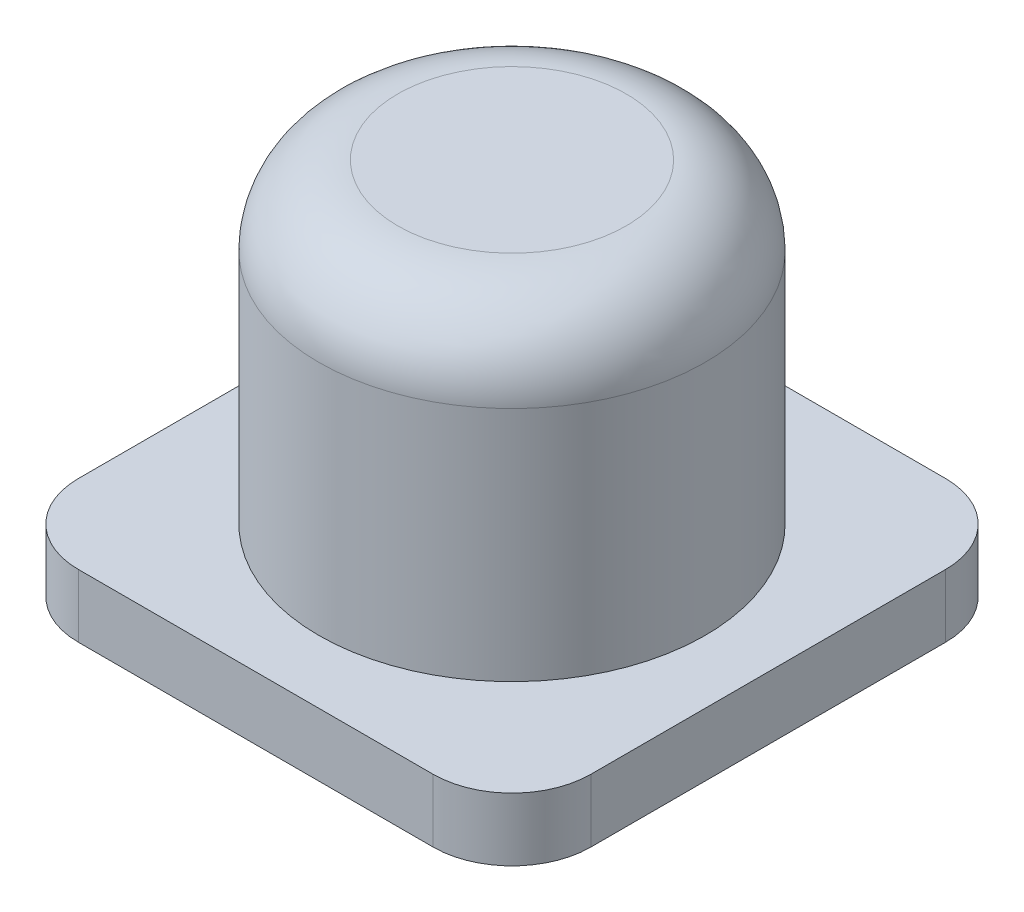
ISO-10303-21;
HEADER;
FILE_DESCRIPTION(('STEP AP214'),'2;1');
FILE_NAME('part.step','',(''),(''),'','','');
FILE_SCHEMA(('AUTOMOTIVE_DESIGN { 1 0 10303 214 1 1 1 1 }'));
ENDSEC;
DATA;
#1=APPLICATION_CONTEXT('core data for automotive mechanical design processes');
#2=APPLICATION_PROTOCOL_DEFINITION('international standard','automotive_design',2000,#1);
#3=PRODUCT_CONTEXT('',#1,'mechanical');
#4=PRODUCT('Part','Part','',(#3));
#5=PRODUCT_RELATED_PRODUCT_CATEGORY('part','',(#4));
#6=PRODUCT_DEFINITION_FORMATION('','',#4);
#7=PRODUCT_DEFINITION_CONTEXT('part definition',#1,'design');
#8=PRODUCT_DEFINITION('design','',#6,#7);
#9=PRODUCT_DEFINITION_SHAPE('','',#8);
#10=(LENGTH_UNIT() NAMED_UNIT(*) SI_UNIT(.MILLI.,.METRE.));
#11=(NAMED_UNIT(*) PLANE_ANGLE_UNIT() SI_UNIT($,.RADIAN.));
#12=(NAMED_UNIT(*) SI_UNIT($,.STERADIAN.) SOLID_ANGLE_UNIT());
#13=UNCERTAINTY_MEASURE_WITH_UNIT(LENGTH_MEASURE(1.E-05),#10,'distance_accuracy_value','');
#14=(GEOMETRIC_REPRESENTATION_CONTEXT(3) GLOBAL_UNCERTAINTY_ASSIGNED_CONTEXT((#13)) GLOBAL_UNIT_ASSIGNED_CONTEXT((#10,
#11,#12)) REPRESENTATION_CONTEXT('',''));
#15=CARTESIAN_POINT('',(0.,0.,0.));
#16=DIRECTION('',(0.,0.,1.));
#17=DIRECTION('',(1.,0.,0.));
#18=AXIS2_PLACEMENT_3D('',#15,#16,#17);
#19=CARTESIAN_POINT('',(1.625,0.4,-1.625));
#20=DIRECTION('',(-1.,0.,0.));
#21=DIRECTION('',(0.,0.,1.));
#22=AXIS2_PLACEMENT_3D('',#19,#20,#21);
#23=PLANE('',#22);
#24=DIRECTION('',(0.,0.,-1.));
#25=VECTOR('',#24,1.);
#26=CARTESIAN_POINT('',(1.625,0.,-1.625));
#27=LINE('',#26,#25);
#28=CARTESIAN_POINT('',(1.625,0.,1.125));
#29=VERTEX_POINT('',#28);
#30=CARTESIAN_POINT('',(1.625,0.,-1.125));
#31=VERTEX_POINT('',#30);
#32=EDGE_CURVE('E164',#29,#31,#27,.T.);
#33=ORIENTED_EDGE('',*,*,#32,.T.);
#34=DIRECTION('',(0.,-1.,0.));
#35=VECTOR('',#34,1.);
#36=CARTESIAN_POINT('',(1.625,0.4,-1.125));
#37=LINE('',#36,#35);
#38=CARTESIAN_POINT('',(1.625,0.4,-1.125));
#39=VERTEX_POINT('',#38);
#40=EDGE_CURVE('E11',#31,#39,#37,.F.);
#41=ORIENTED_EDGE('',*,*,#40,.T.);
#42=DIRECTION('',(0.,0.,-1.));
#43=VECTOR('',#42,1.);
#44=CARTESIAN_POINT('',(1.625,0.4,-1.625));
#45=LINE('',#44,#43);
#46=CARTESIAN_POINT('',(1.625,0.4,1.125));
#47=VERTEX_POINT('',#46);
#48=EDGE_CURVE('E125',#47,#39,#45,.T.);
#49=ORIENTED_EDGE('',*,*,#48,.F.);
#50=DIRECTION('',(0.,-1.,0.));
#51=VECTOR('',#50,1.);
#52=CARTESIAN_POINT('',(1.625,0.4,1.125));
#53=LINE('',#52,#51);
#54=EDGE_CURVE('E41',#47,#29,#53,.T.);
#55=ORIENTED_EDGE('',*,*,#54,.T.);
#56=EDGE_LOOP('',(#33,#41,#49,#55));
#57=FACE_BOUND('',#56,.T.);
#58=ADVANCED_FACE('F33',(#57),#23,.F.);
#59=CARTESIAN_POINT('',(-1.625,0.4,-1.625));
#60=DIRECTION('',(0.,0.,1.));
#61=DIRECTION('',(1.,0.,0.));
#62=AXIS2_PLACEMENT_3D('',#59,#60,#61);
#63=PLANE('',#62);
#64=DIRECTION('',(-1.,0.,0.));
#65=VECTOR('',#64,1.);
#66=CARTESIAN_POINT('',(-1.625,0.,-1.625));
#67=LINE('',#66,#65);
#68=CARTESIAN_POINT('',(1.125,0.,-1.625));
#69=VERTEX_POINT('',#68);
#70=CARTESIAN_POINT('',(-1.125,0.,-1.625));
#71=VERTEX_POINT('',#70);
#72=EDGE_CURVE('E130',#69,#71,#67,.T.);
#73=ORIENTED_EDGE('',*,*,#72,.T.);
#74=DIRECTION('',(0.,-1.,0.));
#75=VECTOR('',#74,1.);
#76=CARTESIAN_POINT('',(-1.125,0.4,-1.625));
#77=LINE('',#76,#75);
#78=CARTESIAN_POINT('',(-1.125,0.4,-1.625));
#79=VERTEX_POINT('',#78);
#80=EDGE_CURVE('E48',#71,#79,#77,.F.);
#81=ORIENTED_EDGE('',*,*,#80,.T.);
#82=DIRECTION('',(-1.,0.,0.));
#83=VECTOR('',#82,1.);
#84=CARTESIAN_POINT('',(-1.625,0.4,-1.625));
#85=LINE('',#84,#83);
#86=CARTESIAN_POINT('',(1.125,0.4,-1.625));
#87=VERTEX_POINT('',#86);
#88=EDGE_CURVE('E128',#87,#79,#85,.T.);
#89=ORIENTED_EDGE('',*,*,#88,.F.);
#90=DIRECTION('',(0.,-1.,0.));
#91=VECTOR('',#90,1.);
#92=CARTESIAN_POINT('',(1.125,0.4,-1.625));
#93=LINE('',#92,#91);
#94=EDGE_CURVE('E156',#87,#69,#93,.T.);
#95=ORIENTED_EDGE('',*,*,#94,.T.);
#96=EDGE_LOOP('',(#73,#81,#89,#95));
#97=FACE_BOUND('',#96,.T.);
#98=ADVANCED_FACE('F191',(#97),#63,.F.);
#99=CARTESIAN_POINT('',(-1.625,0.4,-1.625));
#100=DIRECTION('',(1.,0.,0.));
#101=DIRECTION('',(0.,0.,-1.));
#102=AXIS2_PLACEMENT_3D('',#99,#100,#101);
#103=PLANE('',#102);
#104=DIRECTION('',(0.,0.,1.));
#105=VECTOR('',#104,1.);
#106=CARTESIAN_POINT('',(-1.625,0.,-1.625));
#107=LINE('',#106,#105);
#108=CARTESIAN_POINT('',(-1.625,0.,-1.125));
#109=VERTEX_POINT('',#108);
#110=CARTESIAN_POINT('',(-1.625,0.,1.125));
#111=VERTEX_POINT('',#110);
#112=EDGE_CURVE('E126',#109,#111,#107,.T.);
#113=ORIENTED_EDGE('',*,*,#112,.T.);
#114=DIRECTION('',(0.,-1.,0.));
#115=VECTOR('',#114,1.);
#116=CARTESIAN_POINT('',(-1.625,0.4,1.125));
#117=LINE('',#116,#115);
#118=CARTESIAN_POINT('',(-1.625,0.4,1.125));
#119=VERTEX_POINT('',#118);
#120=EDGE_CURVE('E104',#111,#119,#117,.F.);
#121=ORIENTED_EDGE('',*,*,#120,.T.);
#122=DIRECTION('',(0.,0.,1.));
#123=VECTOR('',#122,1.);
#124=CARTESIAN_POINT('',(-1.625,0.4,-1.625));
#125=LINE('',#124,#123);
#126=CARTESIAN_POINT('',(-1.625,0.4,-1.125));
#127=VERTEX_POINT('',#126);
#128=EDGE_CURVE('E172',#127,#119,#125,.T.);
#129=ORIENTED_EDGE('',*,*,#128,.F.);
#130=DIRECTION('',(0.,-1.,0.));
#131=VECTOR('',#130,1.);
#132=CARTESIAN_POINT('',(-1.625,0.4,-1.125));
#133=LINE('',#132,#131);
#134=EDGE_CURVE('E109',#127,#109,#133,.T.);
#135=ORIENTED_EDGE('',*,*,#134,.T.);
#136=EDGE_LOOP('',(#113,#121,#129,#135));
#137=FACE_BOUND('',#136,.T.);
#138=ADVANCED_FACE('F188',(#137),#103,.F.);
#139=CARTESIAN_POINT('',(-1.625,0.4,1.625));
#140=DIRECTION('',(0.,0.,-1.));
#141=DIRECTION('',(-1.,0.,0.));
#142=AXIS2_PLACEMENT_3D('',#139,#140,#141);
#143=PLANE('',#142);
#144=DIRECTION('',(1.,0.,0.));
#145=VECTOR('',#144,1.);
#146=CARTESIAN_POINT('',(-1.625,0.4,1.625));
#147=LINE('',#146,#145);
#148=CARTESIAN_POINT('',(-1.125,0.4,1.625));
#149=VERTEX_POINT('',#148);
#150=CARTESIAN_POINT('',(1.125,0.4,1.625));
#151=VERTEX_POINT('',#150);
#152=EDGE_CURVE('E119',#149,#151,#147,.T.);
#153=ORIENTED_EDGE('',*,*,#152,.F.);
#154=DIRECTION('',(0.,-1.,0.));
#155=VECTOR('',#154,1.);
#156=CARTESIAN_POINT('',(-1.125,0.4,1.625));
#157=LINE('',#156,#155);
#158=CARTESIAN_POINT('',(-1.125,0.,1.625));
#159=VERTEX_POINT('',#158);
#160=EDGE_CURVE('E103',#149,#159,#157,.T.);
#161=ORIENTED_EDGE('',*,*,#160,.T.);
#162=DIRECTION('',(1.,0.,0.));
#163=VECTOR('',#162,1.);
#164=CARTESIAN_POINT('',(-1.625,0.,1.625));
#165=LINE('',#164,#163);
#166=CARTESIAN_POINT('',(1.125,0.,1.625));
#167=VERTEX_POINT('',#166);
#168=EDGE_CURVE('E116',#159,#167,#165,.T.);
#169=ORIENTED_EDGE('',*,*,#168,.T.);
#170=DIRECTION('',(0.,-1.,0.));
#171=VECTOR('',#170,1.);
#172=CARTESIAN_POINT('',(1.125,0.4,1.625));
#173=LINE('',#172,#171);
#174=EDGE_CURVE('E121',#167,#151,#173,.F.);
#175=ORIENTED_EDGE('',*,*,#174,.T.);
#176=EDGE_LOOP('',(#153,#161,#169,#175));
#177=FACE_BOUND('',#176,.T.);
#178=ADVANCED_FACE('F115',(#177),#143,.F.);
#179=CARTESIAN_POINT('',(0.,0.4,0.));
#180=DIRECTION('',(0.,1.,0.));
#181=DIRECTION('',(0.,0.,1.));
#182=AXIS2_PLACEMENT_3D('',#179,#180,#181);
#183=PLANE('',#182);
#184=CARTESIAN_POINT('',(0.,0.4,0.));
#185=DIRECTION('',(0.,1.,0.));
#186=DIRECTION('',(0.,0.,1.));
#187=AXIS2_PLACEMENT_3D('',#184,#185,#186);
#188=CIRCLE('',#187,1.225);
#189=CARTESIAN_POINT('',(0.,0.4,1.225));
#190=VERTEX_POINT('',#189);
#191=EDGE_CURVE('E138',#190,#190,#188,.T.);
#192=ORIENTED_EDGE('',*,*,#191,.F.);
#193=EDGE_LOOP('',(#192));
#194=FACE_BOUND('',#193,.T.);
#195=ORIENTED_EDGE('',*,*,#128,.T.);
#196=CARTESIAN_POINT('',(-1.125,0.4,1.125));
#197=DIRECTION('',(0.,1.,0.));
#198=DIRECTION('',(0.,0.,1.));
#199=AXIS2_PLACEMENT_3D('',#196,#197,#198);
#200=CIRCLE('',#199,0.5);
#201=EDGE_CURVE('E154',#119,#149,#200,.T.);
#202=ORIENTED_EDGE('',*,*,#201,.T.);
#203=ORIENTED_EDGE('',*,*,#152,.T.);
#204=CARTESIAN_POINT('',(1.125,0.4,1.125));
#205=DIRECTION('',(0.,1.,0.));
#206=DIRECTION('',(0.,0.,1.));
#207=AXIS2_PLACEMENT_3D('',#204,#205,#206);
#208=CIRCLE('',#207,0.5);
#209=EDGE_CURVE('E149',#151,#47,#208,.T.);
#210=ORIENTED_EDGE('',*,*,#209,.T.);
#211=ORIENTED_EDGE('',*,*,#48,.T.);
#212=CARTESIAN_POINT('',(1.125,0.4,-1.125));
#213=DIRECTION('',(0.,1.,0.));
#214=DIRECTION('',(0.,0.,1.));
#215=AXIS2_PLACEMENT_3D('',#212,#213,#214);
#216=CIRCLE('',#215,0.5);
#217=EDGE_CURVE('E55',#39,#87,#216,.T.);
#218=ORIENTED_EDGE('',*,*,#217,.T.);
#219=ORIENTED_EDGE('',*,*,#88,.T.);
#220=CARTESIAN_POINT('',(-1.125,0.4,-1.125));
#221=DIRECTION('',(0.,1.,0.));
#222=DIRECTION('',(0.,0.,1.));
#223=AXIS2_PLACEMENT_3D('',#220,#221,#222);
#224=CIRCLE('',#223,0.5);
#225=EDGE_CURVE('E152',#79,#127,#224,.T.);
#226=ORIENTED_EDGE('',*,*,#225,.T.);
#227=EDGE_LOOP('',(#195,#202,#203,#210,#211,#218,#219,#226));
#228=FACE_BOUND('',#227,.T.);
#229=ADVANCED_FACE('F181',(#194,#228),#183,.T.);
#230=CARTESIAN_POINT('',(0.,0.,0.));
#231=DIRECTION('',(0.,1.,0.));
#232=DIRECTION('',(0.,0.,1.));
#233=AXIS2_PLACEMENT_3D('',#230,#231,#232);
#234=PLANE('',#233);
#235=ORIENTED_EDGE('',*,*,#168,.F.);
#236=CARTESIAN_POINT('',(-1.125,0.,1.125));
#237=DIRECTION('',(0.,1.,0.));
#238=DIRECTION('',(0.,0.,1.));
#239=AXIS2_PLACEMENT_3D('',#236,#237,#238);
#240=CIRCLE('',#239,0.5);
#241=EDGE_CURVE('E99',#159,#111,#240,.F.);
#242=ORIENTED_EDGE('',*,*,#241,.T.);
#243=ORIENTED_EDGE('',*,*,#112,.F.);
#244=CARTESIAN_POINT('',(-1.125,0.,-1.125));
#245=DIRECTION('',(0.,1.,0.));
#246=DIRECTION('',(0.,0.,1.));
#247=AXIS2_PLACEMENT_3D('',#244,#245,#246);
#248=CIRCLE('',#247,0.5);
#249=EDGE_CURVE('E110',#109,#71,#248,.F.);
#250=ORIENTED_EDGE('',*,*,#249,.T.);
#251=ORIENTED_EDGE('',*,*,#72,.F.);
#252=CARTESIAN_POINT('',(1.125,0.,-1.125));
#253=DIRECTION('',(0.,1.,0.));
#254=DIRECTION('',(0.,0.,1.));
#255=AXIS2_PLACEMENT_3D('',#252,#253,#254);
#256=CIRCLE('',#255,0.5);
#257=EDGE_CURVE('E143',#69,#31,#256,.F.);
#258=ORIENTED_EDGE('',*,*,#257,.T.);
#259=ORIENTED_EDGE('',*,*,#32,.F.);
#260=CARTESIAN_POINT('',(1.125,0.,1.125));
#261=DIRECTION('',(0.,1.,0.));
#262=DIRECTION('',(0.,0.,1.));
#263=AXIS2_PLACEMENT_3D('',#260,#261,#262);
#264=CIRCLE('',#263,0.5);
#265=EDGE_CURVE('E120',#29,#167,#264,.F.);
#266=ORIENTED_EDGE('',*,*,#265,.T.);
#267=EDGE_LOOP('',(#235,#242,#243,#250,#251,#258,#259,#266));
#268=FACE_BOUND('',#267,.T.);
#269=ADVANCED_FACE('F123',(#268),#234,.F.);
#270=CARTESIAN_POINT('',(0.,2.4,0.));
#271=DIRECTION('',(0.,-1.,0.));
#272=DIRECTION('',(0.,0.,-1.));
#273=AXIS2_PLACEMENT_3D('',#270,#271,#272);
#274=CYLINDRICAL_SURFACE('',#273,1.225);
#275=CARTESIAN_POINT('',(0.,1.9,0.));
#276=DIRECTION('',(0.,1.,0.));
#277=DIRECTION('',(0.,0.,1.));
#278=AXIS2_PLACEMENT_3D('',#275,#276,#277);
#279=CIRCLE('',#278,1.225);
#280=CARTESIAN_POINT('',(0.,1.9,1.225));
#281=VERTEX_POINT('',#280);
#282=EDGE_CURVE('E137',#281,#281,#279,.F.);
#283=ORIENTED_EDGE('',*,*,#282,.T.);
#284=EDGE_LOOP('',(#283));
#285=FACE_BOUND('',#284,.T.);
#286=ORIENTED_EDGE('',*,*,#191,.T.);
#287=EDGE_LOOP('',(#286));
#288=FACE_BOUND('',#287,.T.);
#289=ADVANCED_FACE('F179',(#285,#288),#274,.T.);
#290=CARTESIAN_POINT('',(0.,2.4,0.));
#291=DIRECTION('',(0.,1.,0.));
#292=DIRECTION('',(0.,0.,1.));
#293=AXIS2_PLACEMENT_3D('',#290,#291,#292);
#294=PLANE('',#293);
#295=CARTESIAN_POINT('',(0.,2.4,0.));
#296=DIRECTION('',(0.,1.,0.));
#297=DIRECTION('',(0.,0.,1.));
#298=AXIS2_PLACEMENT_3D('',#295,#296,#297);
#299=CIRCLE('',#298,0.725);
#300=CARTESIAN_POINT('',(0.,2.4,0.725));
#301=VERTEX_POINT('',#300);
#302=EDGE_CURVE('E134',#301,#301,#299,.T.);
#303=ORIENTED_EDGE('',*,*,#302,.T.);
#304=EDGE_LOOP('',(#303));
#305=FACE_BOUND('',#304,.T.);
#306=ADVANCED_FACE('F210',(#305),#294,.T.);
#307=CARTESIAN_POINT('',(0.,1.9,0.));
#308=DIRECTION('',(0.,1.,0.));
#309=DIRECTION('',(0.,0.,1.));
#310=AXIS2_PLACEMENT_3D('',#307,#308,#309);
#311=TOROIDAL_SURFACE('',#310,0.725,0.5);
#312=ORIENTED_EDGE('',*,*,#282,.F.);
#313=EDGE_LOOP('',(#312));
#314=FACE_BOUND('',#313,.T.);
#315=ORIENTED_EDGE('',*,*,#302,.F.);
#316=EDGE_LOOP('',(#315));
#317=FACE_BOUND('',#316,.T.);
#318=ADVANCED_FACE('F207',(#314,#317),#311,.T.);
#319=CARTESIAN_POINT('',(-1.125,0.4,1.125));
#320=DIRECTION('',(0.,-1.,0.));
#321=DIRECTION('',(0.,0.,-1.));
#322=AXIS2_PLACEMENT_3D('',#319,#320,#321);
#323=CYLINDRICAL_SURFACE('',#322,0.5);
#324=ORIENTED_EDGE('',*,*,#201,.F.);
#325=ORIENTED_EDGE('',*,*,#120,.F.);
#326=ORIENTED_EDGE('',*,*,#241,.F.);
#327=ORIENTED_EDGE('',*,*,#160,.F.);
#328=EDGE_LOOP('',(#324,#325,#326,#327));
#329=FACE_BOUND('',#328,.T.);
#330=ADVANCED_FACE('F102',(#329),#323,.T.);
#331=CARTESIAN_POINT('',(-1.125,0.4,-1.125));
#332=DIRECTION('',(0.,-1.,0.));
#333=DIRECTION('',(0.,0.,-1.));
#334=AXIS2_PLACEMENT_3D('',#331,#332,#333);
#335=CYLINDRICAL_SURFACE('',#334,0.5);
#336=ORIENTED_EDGE('',*,*,#225,.F.);
#337=ORIENTED_EDGE('',*,*,#80,.F.);
#338=ORIENTED_EDGE('',*,*,#249,.F.);
#339=ORIENTED_EDGE('',*,*,#134,.F.);
#340=EDGE_LOOP('',(#336,#337,#338,#339));
#341=FACE_BOUND('',#340,.T.);
#342=ADVANCED_FACE('F190',(#341),#335,.T.);
#343=CARTESIAN_POINT('',(1.125,0.4,-1.125));
#344=DIRECTION('',(0.,-1.,0.));
#345=DIRECTION('',(0.,0.,-1.));
#346=AXIS2_PLACEMENT_3D('',#343,#344,#345);
#347=CYLINDRICAL_SURFACE('',#346,0.5);
#348=ORIENTED_EDGE('',*,*,#217,.F.);
#349=ORIENTED_EDGE('',*,*,#40,.F.);
#350=ORIENTED_EDGE('',*,*,#257,.F.);
#351=ORIENTED_EDGE('',*,*,#94,.F.);
#352=EDGE_LOOP('',(#348,#349,#350,#351));
#353=FACE_BOUND('',#352,.T.);
#354=ADVANCED_FACE('F194',(#353),#347,.T.);
#355=CARTESIAN_POINT('',(1.125,0.4,1.125));
#356=DIRECTION('',(0.,-1.,0.));
#357=DIRECTION('',(0.,0.,-1.));
#358=AXIS2_PLACEMENT_3D('',#355,#356,#357);
#359=CYLINDRICAL_SURFACE('',#358,0.5);
#360=ORIENTED_EDGE('',*,*,#209,.F.);
#361=ORIENTED_EDGE('',*,*,#174,.F.);
#362=ORIENTED_EDGE('',*,*,#265,.F.);
#363=ORIENTED_EDGE('',*,*,#54,.F.);
#364=EDGE_LOOP('',(#360,#361,#362,#363));
#365=FACE_BOUND('',#364,.T.);
#366=ADVANCED_FACE('F35',(#365),#359,.T.);
#367=CLOSED_SHELL('',(#58,#98,#138,#178,#229,#269,#289,#306,#318,#330,#342,#354,#366));
#368=MANIFOLD_SOLID_BREP('B2',#367);
#369=ADVANCED_BREP_SHAPE_REPRESENTATION('',(#18,#368),#14);
#370=SHAPE_DEFINITION_REPRESENTATION(#9,#369);
ENDSEC;
END-ISO-10303-21;
